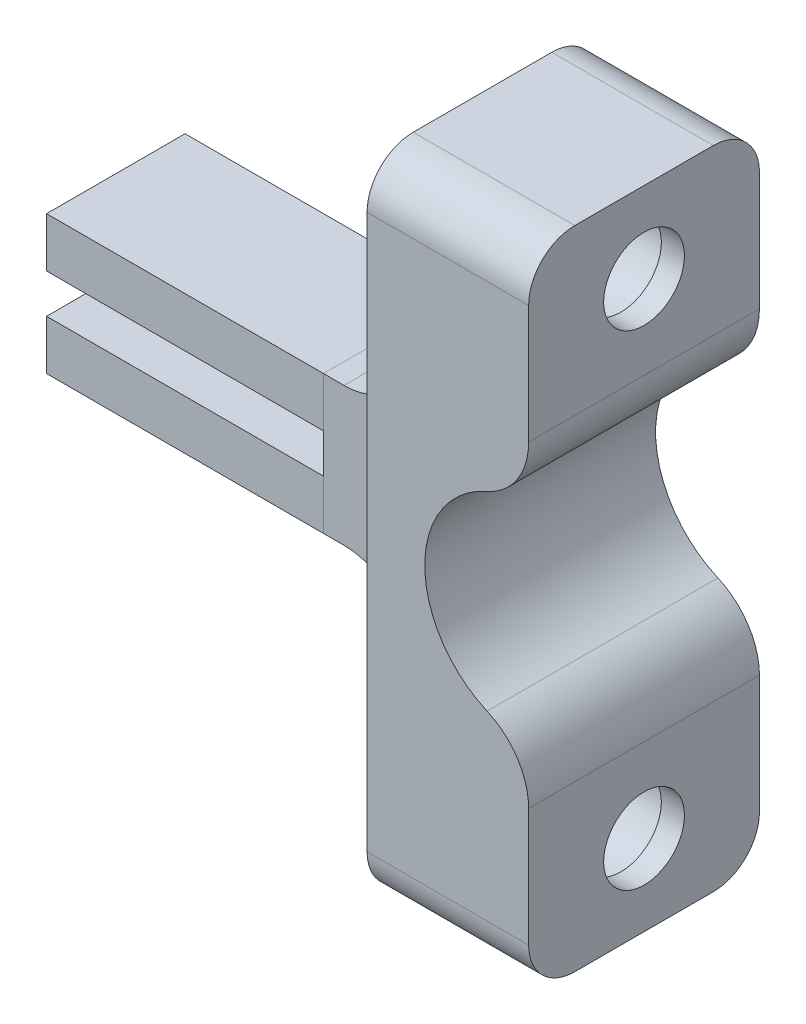
ISO-10303-21;
HEADER;
FILE_DESCRIPTION(('STEP AP214'),'2;1');
FILE_NAME('part.step','',(''),(''),'','','');
FILE_SCHEMA(('AUTOMOTIVE_DESIGN { 1 0 10303 214 1 1 1 1 }'));
ENDSEC;
DATA;
#1=APPLICATION_CONTEXT('core data for automotive mechanical design processes');
#2=APPLICATION_PROTOCOL_DEFINITION('international standard','automotive_design',2000,#1);
#3=PRODUCT_CONTEXT('',#1,'mechanical');
#4=PRODUCT('Part','Part','',(#3));
#5=PRODUCT_RELATED_PRODUCT_CATEGORY('part','',(#4));
#6=PRODUCT_DEFINITION_FORMATION('','',#4);
#7=PRODUCT_DEFINITION_CONTEXT('part definition',#1,'design');
#8=PRODUCT_DEFINITION('design','',#6,#7);
#9=PRODUCT_DEFINITION_SHAPE('','',#8);
#10=(LENGTH_UNIT() NAMED_UNIT(*) SI_UNIT(.MILLI.,.METRE.));
#11=(NAMED_UNIT(*) PLANE_ANGLE_UNIT() SI_UNIT($,.RADIAN.));
#12=(NAMED_UNIT(*) SI_UNIT($,.STERADIAN.) SOLID_ANGLE_UNIT());
#13=UNCERTAINTY_MEASURE_WITH_UNIT(LENGTH_MEASURE(1.E-05),#10,'distance_accuracy_value','');
#14=(GEOMETRIC_REPRESENTATION_CONTEXT(3) GLOBAL_UNCERTAINTY_ASSIGNED_CONTEXT((#13)) GLOBAL_UNIT_ASSIGNED_CONTEXT((#10,
#11,#12)) REPRESENTATION_CONTEXT('',''));
#15=CARTESIAN_POINT('',(0.,0.,0.));
#16=DIRECTION('',(0.,0.,1.));
#17=DIRECTION('',(1.,0.,0.));
#18=AXIS2_PLACEMENT_3D('',#15,#16,#17);
#19=CARTESIAN_POINT('',(0.888345193090202,-10.5,0.));
#20=DIRECTION('',(1.,0.,0.));
#21=DIRECTION('',(0.,0.,-1.));
#22=AXIS2_PLACEMENT_3D('',#19,#20,#21);
#23=CYLINDRICAL_SURFACE('',#22,2.25);
#24=CARTESIAN_POINT('',(9.8883451930902,-10.5,0.));
#25=DIRECTION('',(1.,0.,0.));
#26=DIRECTION('',(0.,0.,-1.));
#27=AXIS2_PLACEMENT_3D('',#24,#25,#26);
#28=CIRCLE('',#27,2.25);
#29=CARTESIAN_POINT('',(9.8883451930902,-10.5,-2.25));
#30=VERTEX_POINT('',#29);
#31=EDGE_CURVE('E284',#30,#30,#28,.T.);
#32=ORIENTED_EDGE('',*,*,#31,.F.);
#33=EDGE_LOOP('',(#32));
#34=FACE_BOUND('',#33,.T.);
#35=CARTESIAN_POINT('',(15.8883451930902,-10.5,0.));
#36=DIRECTION('',(1.,0.,0.));
#37=DIRECTION('',(0.,0.,-1.));
#38=AXIS2_PLACEMENT_3D('',#35,#36,#37);
#39=CIRCLE('',#38,2.25);
#40=CARTESIAN_POINT('',(15.8883451930902,-10.5,-2.25));
#41=VERTEX_POINT('',#40);
#42=EDGE_CURVE('E12',#41,#41,#39,.F.);
#43=ORIENTED_EDGE('',*,*,#42,.F.);
#44=EDGE_LOOP('',(#43));
#45=FACE_BOUND('',#44,.T.);
#46=ADVANCED_FACE('F46',(#34,#45),#23,.F.);
#47=CARTESIAN_POINT('',(0.888345193090202,10.5,0.));
#48=DIRECTION('',(1.,0.,0.));
#49=DIRECTION('',(0.,0.,-1.));
#50=AXIS2_PLACEMENT_3D('',#47,#48,#49);
#51=CYLINDRICAL_SURFACE('',#50,2.25);
#52=CARTESIAN_POINT('',(9.8883451930902,10.5,0.));
#53=DIRECTION('',(1.,0.,0.));
#54=DIRECTION('',(0.,0.,-1.));
#55=AXIS2_PLACEMENT_3D('',#52,#53,#54);
#56=CIRCLE('',#55,2.25);
#57=CARTESIAN_POINT('',(9.8883451930902,10.5,-2.25));
#58=VERTEX_POINT('',#57);
#59=EDGE_CURVE('E287',#58,#58,#56,.T.);
#60=ORIENTED_EDGE('',*,*,#59,.F.);
#61=EDGE_LOOP('',(#60));
#62=FACE_BOUND('',#61,.T.);
#63=CARTESIAN_POINT('',(15.8883451930902,10.5,0.));
#64=DIRECTION('',(1.,0.,0.));
#65=DIRECTION('',(0.,0.,-1.));
#66=AXIS2_PLACEMENT_3D('',#63,#64,#65);
#67=CIRCLE('',#66,2.25);
#68=CARTESIAN_POINT('',(15.8883451930902,10.5,-2.25));
#69=VERTEX_POINT('',#68);
#70=EDGE_CURVE('E54',#69,#69,#67,.F.);
#71=ORIENTED_EDGE('',*,*,#70,.F.);
#72=EDGE_LOOP('',(#71));
#73=FACE_BOUND('',#72,.T.);
#74=ADVANCED_FACE('F293',(#62,#73),#51,.F.);
#75=CARTESIAN_POINT('',(16.8883451930902,14.,5.));
#76=DIRECTION('',(-1.,0.,0.));
#77=DIRECTION('',(0.,0.,1.));
#78=AXIS2_PLACEMENT_3D('',#75,#76,#77);
#79=PLANE('',#78);
#80=DIRECTION('',(0.,0.,-1.));
#81=VECTOR('',#80,1.);
#82=CARTESIAN_POINT('',(16.8883451930902,-14.,5.));
#83=LINE('',#82,#81);
#84=CARTESIAN_POINT('',(16.8883451930902,-14.,3.));
#85=VERTEX_POINT('',#84);
#86=CARTESIAN_POINT('',(16.8883451930902,-14.,-3.));
#87=VERTEX_POINT('',#86);
#88=EDGE_CURVE('E411',#85,#87,#83,.T.);
#89=ORIENTED_EDGE('',*,*,#88,.T.);
#90=CARTESIAN_POINT('',(16.8883451930902,-12.,-3.));
#91=DIRECTION('',(-1.,0.,0.));
#92=DIRECTION('',(0.,0.,1.));
#93=AXIS2_PLACEMENT_3D('',#90,#91,#92);
#94=CIRCLE('',#93,2.);
#95=CARTESIAN_POINT('',(16.8883451930902,-12.,-5.));
#96=VERTEX_POINT('',#95);
#97=EDGE_CURVE('E69',#87,#96,#94,.F.);
#98=ORIENTED_EDGE('',*,*,#97,.T.);
#99=DIRECTION('',(0.,1.,0.));
#100=VECTOR('',#99,1.);
#101=CARTESIAN_POINT('',(16.8883451930902,14.,-5.));
#102=LINE('',#101,#100);
#103=CARTESIAN_POINT('',(16.8883451930902,-6.87386354243376,-5.));
#104=VERTEX_POINT('',#103);
#105=EDGE_CURVE('E393',#96,#104,#102,.T.);
#106=ORIENTED_EDGE('',*,*,#105,.T.);
#107=DIRECTION('',(0.,0.,1.));
#108=VECTOR('',#107,1.);
#109=CARTESIAN_POINT('',(16.8883451930902,-6.87386354243376,5.));
#110=LINE('',#109,#108);
#111=CARTESIAN_POINT('',(16.8883451930902,-6.87386354243376,5.));
#112=VERTEX_POINT('',#111);
#113=EDGE_CURVE('E213',#104,#112,#110,.T.);
#114=ORIENTED_EDGE('',*,*,#113,.T.);
#115=DIRECTION('',(0.,1.,0.));
#116=VECTOR('',#115,1.);
#117=CARTESIAN_POINT('',(16.8883451930902,14.,5.));
#118=LINE('',#117,#116);
#119=CARTESIAN_POINT('',(16.8883451930902,-12.,5.));
#120=VERTEX_POINT('',#119);
#121=EDGE_CURVE('E395',#120,#112,#118,.T.);
#122=ORIENTED_EDGE('',*,*,#121,.F.);
#123=CARTESIAN_POINT('',(16.8883451930902,-12.,3.));
#124=DIRECTION('',(-1.,0.,0.));
#125=DIRECTION('',(0.,0.,1.));
#126=AXIS2_PLACEMENT_3D('',#123,#124,#125);
#127=CIRCLE('',#126,2.);
#128=EDGE_CURVE('E61',#120,#85,#127,.F.);
#129=ORIENTED_EDGE('',*,*,#128,.T.);
#130=EDGE_LOOP('',(#89,#98,#106,#114,#122,#129));
#131=FACE_BOUND('',#130,.T.);
#132=CARTESIAN_POINT('',(16.8883451930902,-10.5,0.));
#133=DIRECTION('',(1.,0.,0.));
#134=DIRECTION('',(0.,0.,-1.));
#135=AXIS2_PLACEMENT_3D('',#132,#133,#134);
#136=CIRCLE('',#135,1.75);
#137=CARTESIAN_POINT('',(16.8883451930902,-10.5,-1.75));
#138=VERTEX_POINT('',#137);
#139=EDGE_CURVE('E452',#138,#138,#136,.T.);
#140=ORIENTED_EDGE('',*,*,#139,.F.);
#141=EDGE_LOOP('',(#140));
#142=FACE_BOUND('',#141,.T.);
#143=ADVANCED_FACE('F295',(#131,#142),#79,.F.);
#144=CARTESIAN_POINT('',(9.8883451930902,14.,5.));
#145=DIRECTION('',(1.,0.,0.));
#146=DIRECTION('',(0.,0.,-1.));
#147=AXIS2_PLACEMENT_3D('',#144,#145,#146);
#148=PLANE('',#147);
#149=ORIENTED_EDGE('',*,*,#59,.T.);
#150=EDGE_LOOP('',(#149));
#151=FACE_BOUND('',#150,.T.);
#152=ORIENTED_EDGE('',*,*,#31,.T.);
#153=EDGE_LOOP('',(#152));
#154=FACE_BOUND('',#153,.T.);
#155=DIRECTION('',(0.,0.,-1.));
#156=VECTOR('',#155,1.);
#157=CARTESIAN_POINT('',(9.8883451930902,14.,5.));
#158=LINE('',#157,#156);
#159=CARTESIAN_POINT('',(9.8883451930902,14.,3.));
#160=VERTEX_POINT('',#159);
#161=CARTESIAN_POINT('',(9.8883451930902,14.,-3.));
#162=VERTEX_POINT('',#161);
#163=EDGE_CURVE('E403',#160,#162,#158,.T.);
#164=ORIENTED_EDGE('',*,*,#163,.T.);
#165=CARTESIAN_POINT('',(9.8883451930902,12.,-3.));
#166=DIRECTION('',(1.,0.,0.));
#167=DIRECTION('',(0.,0.,-1.));
#168=AXIS2_PLACEMENT_3D('',#165,#166,#167);
#169=CIRCLE('',#168,2.);
#170=CARTESIAN_POINT('',(9.8883451930902,12.,-5.));
#171=VERTEX_POINT('',#170);
#172=EDGE_CURVE('E263',#162,#171,#169,.F.);
#173=ORIENTED_EDGE('',*,*,#172,.T.);
#174=DIRECTION('',(0.,-1.,0.));
#175=VECTOR('',#174,1.);
#176=CARTESIAN_POINT('',(9.8883451930902,14.,-5.));
#177=LINE('',#176,#175);
#178=CARTESIAN_POINT('',(9.8883451930902,-12.,-5.));
#179=VERTEX_POINT('',#178);
#180=EDGE_CURVE('E404',#171,#179,#177,.T.);
#181=ORIENTED_EDGE('',*,*,#180,.T.);
#182=CARTESIAN_POINT('',(9.8883451930902,-12.,-3.));
#183=DIRECTION('',(1.,0.,0.));
#184=DIRECTION('',(0.,0.,-1.));
#185=AXIS2_PLACEMENT_3D('',#182,#183,#184);
#186=CIRCLE('',#185,2.);
#187=CARTESIAN_POINT('',(9.8883451930902,-14.,-3.));
#188=VERTEX_POINT('',#187);
#189=EDGE_CURVE('E261',#179,#188,#186,.F.);
#190=ORIENTED_EDGE('',*,*,#189,.T.);
#191=DIRECTION('',(0.,0.,-1.));
#192=VECTOR('',#191,1.);
#193=CARTESIAN_POINT('',(9.8883451930902,-14.,5.));
#194=LINE('',#193,#192);
#195=CARTESIAN_POINT('',(9.8883451930902,-14.,3.));
#196=VERTEX_POINT('',#195);
#197=EDGE_CURVE('E388',#196,#188,#194,.T.);
#198=ORIENTED_EDGE('',*,*,#197,.F.);
#199=CARTESIAN_POINT('',(9.8883451930902,-12.,3.));
#200=DIRECTION('',(1.,0.,0.));
#201=DIRECTION('',(0.,0.,-1.));
#202=AXIS2_PLACEMENT_3D('',#199,#200,#201);
#203=CIRCLE('',#202,2.);
#204=CARTESIAN_POINT('',(9.8883451930902,-12.,5.));
#205=VERTEX_POINT('',#204);
#206=EDGE_CURVE('E259',#196,#205,#203,.F.);
#207=ORIENTED_EDGE('',*,*,#206,.T.);
#208=DIRECTION('',(0.,-1.,0.));
#209=VECTOR('',#208,1.);
#210=CARTESIAN_POINT('',(9.8883451930902,14.,5.));
#211=LINE('',#210,#209);
#212=CARTESIAN_POINT('',(9.8883451930902,12.,5.));
#213=VERTEX_POINT('',#212);
#214=EDGE_CURVE('E386',#213,#205,#211,.T.);
#215=ORIENTED_EDGE('',*,*,#214,.F.);
#216=CARTESIAN_POINT('',(9.8883451930902,12.,3.));
#217=DIRECTION('',(1.,0.,0.));
#218=DIRECTION('',(0.,0.,-1.));
#219=AXIS2_PLACEMENT_3D('',#216,#217,#218);
#220=CIRCLE('',#219,2.);
#221=EDGE_CURVE('E257',#213,#160,#220,.F.);
#222=ORIENTED_EDGE('',*,*,#221,.T.);
#223=EDGE_LOOP('',(#164,#173,#181,#190,#198,#207,#215,#222));
#224=FACE_BOUND('',#223,.T.);
#225=DIRECTION('',(0.,1.,0.));
#226=VECTOR('',#225,1.);
#227=CARTESIAN_POINT('',(9.8883451930902,0.,3.));
#228=LINE('',#227,#226);
#229=CARTESIAN_POINT('',(9.8883451930902,-6.,3.));
#230=VERTEX_POINT('',#229);
#231=CARTESIAN_POINT('',(9.8883451930902,6.,3.));
#232=VERTEX_POINT('',#231);
#233=EDGE_CURVE('E210',#230,#232,#228,.T.);
#234=ORIENTED_EDGE('',*,*,#233,.F.);
#235=DIRECTION('',(0.,0.,1.));
#236=VECTOR('',#235,1.);
#237=CARTESIAN_POINT('',(9.8883451930902,-6.,5.));
#238=LINE('',#237,#236);
#239=CARTESIAN_POINT('',(9.8883451930902,-6.,-3.));
#240=VERTEX_POINT('',#239);
#241=EDGE_CURVE('E237',#230,#240,#238,.F.);
#242=ORIENTED_EDGE('',*,*,#241,.T.);
#243=DIRECTION('',(0.,1.,0.));
#244=VECTOR('',#243,1.);
#245=CARTESIAN_POINT('',(9.8883451930902,0.,-3.));
#246=LINE('',#245,#244);
#247=CARTESIAN_POINT('',(9.8883451930902,6.,-3.));
#248=VERTEX_POINT('',#247);
#249=EDGE_CURVE('E203',#240,#248,#246,.T.);
#250=ORIENTED_EDGE('',*,*,#249,.T.);
#251=DIRECTION('',(0.,0.,-1.));
#252=VECTOR('',#251,1.);
#253=CARTESIAN_POINT('',(9.8883451930902,6.,5.));
#254=LINE('',#253,#252);
#255=EDGE_CURVE('E234',#248,#232,#254,.F.);
#256=ORIENTED_EDGE('',*,*,#255,.T.);
#257=EDGE_LOOP('',(#234,#242,#250,#256));
#258=FACE_BOUND('',#257,.T.);
#259=ADVANCED_FACE('F302',(#151,#154,#224,#258),#148,.F.);
#260=CARTESIAN_POINT('',(9.8883451930902,-14.,5.));
#261=DIRECTION('',(0.,1.,0.));
#262=DIRECTION('',(0.,0.,1.));
#263=AXIS2_PLACEMENT_3D('',#260,#261,#262);
#264=PLANE('',#263);
#265=ORIENTED_EDGE('',*,*,#197,.T.);
#266=DIRECTION('',(1.,0.,0.));
#267=VECTOR('',#266,1.);
#268=CARTESIAN_POINT('',(9.8883451930902,-14.,-3.));
#269=LINE('',#268,#267);
#270=EDGE_CURVE('E275',#188,#87,#269,.T.);
#271=ORIENTED_EDGE('',*,*,#270,.T.);
#272=ORIENTED_EDGE('',*,*,#88,.F.);
#273=DIRECTION('',(1.,0.,0.));
#274=VECTOR('',#273,1.);
#275=CARTESIAN_POINT('',(9.8883451930902,-14.,3.));
#276=LINE('',#275,#274);
#277=EDGE_CURVE('E273',#85,#196,#276,.F.);
#278=ORIENTED_EDGE('',*,*,#277,.T.);
#279=EDGE_LOOP('',(#265,#271,#272,#278));
#280=FACE_BOUND('',#279,.T.);
#281=ADVANCED_FACE('F331',(#280),#264,.F.);
#282=CARTESIAN_POINT('',(16.8883451930902,6.87386354243376,-5.));
#283=VERTEX_POINT('',#282);
#284=CARTESIAN_POINT('',(16.8883451930902,12.,-5.));
#285=VERTEX_POINT('',#284);
#286=EDGE_CURVE('E397',#283,#285,#102,.T.);
#287=ORIENTED_EDGE('',*,*,#286,.T.);
#288=CARTESIAN_POINT('',(16.8883451930902,12.,-3.));
#289=DIRECTION('',(-1.,0.,0.));
#290=DIRECTION('',(0.,0.,1.));
#291=AXIS2_PLACEMENT_3D('',#288,#289,#290);
#292=CIRCLE('',#291,2.);
#293=CARTESIAN_POINT('',(16.8883451930902,14.,-3.));
#294=VERTEX_POINT('',#293);
#295=EDGE_CURVE('E271',#285,#294,#292,.F.);
#296=ORIENTED_EDGE('',*,*,#295,.T.);
#297=DIRECTION('',(0.,0.,-1.));
#298=VECTOR('',#297,1.);
#299=CARTESIAN_POINT('',(16.8883451930902,14.,5.));
#300=LINE('',#299,#298);
#301=CARTESIAN_POINT('',(16.8883451930902,14.,3.));
#302=VERTEX_POINT('',#301);
#303=EDGE_CURVE('E408',#302,#294,#300,.T.);
#304=ORIENTED_EDGE('',*,*,#303,.F.);
#305=CARTESIAN_POINT('',(16.8883451930902,12.,3.));
#306=DIRECTION('',(-1.,0.,0.));
#307=DIRECTION('',(0.,0.,1.));
#308=AXIS2_PLACEMENT_3D('',#305,#306,#307);
#309=CIRCLE('',#308,2.);
#310=CARTESIAN_POINT('',(16.8883451930902,12.,5.));
#311=VERTEX_POINT('',#310);
#312=EDGE_CURVE('E269',#302,#311,#309,.F.);
#313=ORIENTED_EDGE('',*,*,#312,.T.);
#314=CARTESIAN_POINT('',(16.8883451930902,6.87386354243376,5.));
#315=VERTEX_POINT('',#314);
#316=EDGE_CURVE('E392',#315,#311,#118,.T.);
#317=ORIENTED_EDGE('',*,*,#316,.F.);
#318=DIRECTION('',(0.,0.,1.));
#319=VECTOR('',#318,1.);
#320=CARTESIAN_POINT('',(16.8883451930902,6.87386354243376,5.));
#321=LINE('',#320,#319);
#322=EDGE_CURVE('E229',#315,#283,#321,.F.);
#323=ORIENTED_EDGE('',*,*,#322,.T.);
#324=EDGE_LOOP('',(#287,#296,#304,#313,#317,#323));
#325=FACE_BOUND('',#324,.T.);
#326=CARTESIAN_POINT('',(16.8883451930902,10.5,0.));
#327=DIRECTION('',(1.,0.,0.));
#328=DIRECTION('',(0.,0.,-1.));
#329=AXIS2_PLACEMENT_3D('',#326,#327,#328);
#330=CIRCLE('',#329,1.75);
#331=CARTESIAN_POINT('',(16.8883451930902,10.5,-1.75));
#332=VERTEX_POINT('',#331);
#333=EDGE_CURVE('E446',#332,#332,#330,.T.);
#334=ORIENTED_EDGE('',*,*,#333,.F.);
#335=EDGE_LOOP('',(#334));
#336=FACE_BOUND('',#335,.T.);
#337=ADVANCED_FACE('F305',(#325,#336),#79,.F.);
#338=CARTESIAN_POINT('',(9.8883451930902,14.,5.));
#339=DIRECTION('',(0.,-1.,0.));
#340=DIRECTION('',(0.,0.,-1.));
#341=AXIS2_PLACEMENT_3D('',#338,#339,#340);
#342=PLANE('',#341);
#343=ORIENTED_EDGE('',*,*,#303,.T.);
#344=DIRECTION('',(-1.,0.,0.));
#345=VECTOR('',#344,1.);
#346=CARTESIAN_POINT('',(9.8883451930902,14.,-3.));
#347=LINE('',#346,#345);
#348=EDGE_CURVE('E254',#294,#162,#347,.T.);
#349=ORIENTED_EDGE('',*,*,#348,.T.);
#350=ORIENTED_EDGE('',*,*,#163,.F.);
#351=DIRECTION('',(-1.,0.,0.));
#352=VECTOR('',#351,1.);
#353=CARTESIAN_POINT('',(16.8883451930902,14.,3.));
#354=LINE('',#353,#352);
#355=EDGE_CURVE('E252',#160,#302,#354,.F.);
#356=ORIENTED_EDGE('',*,*,#355,.T.);
#357=EDGE_LOOP('',(#343,#349,#350,#356));
#358=FACE_BOUND('',#357,.T.);
#359=ADVANCED_FACE('F321',(#358),#342,.F.);
#360=CARTESIAN_POINT('',(0.,0.,5.));
#361=DIRECTION('',(0.,0.,1.));
#362=DIRECTION('',(1.,0.,0.));
#363=AXIS2_PLACEMENT_3D('',#360,#361,#362);
#364=PLANE('',#363);
#365=ORIENTED_EDGE('',*,*,#214,.T.);
#366=DIRECTION('',(1.,0.,0.));
#367=VECTOR('',#366,1.);
#368=CARTESIAN_POINT('',(16.8883451930902,-12.,5.));
#369=LINE('',#368,#367);
#370=EDGE_CURVE('E282',#205,#120,#369,.T.);
#371=ORIENTED_EDGE('',*,*,#370,.T.);
#372=ORIENTED_EDGE('',*,*,#121,.T.);
#373=CARTESIAN_POINT('',(13.8883451930902,-6.87386354243376,5.));
#374=DIRECTION('',(0.,0.,1.));
#375=DIRECTION('',(1.,0.,0.));
#376=AXIS2_PLACEMENT_3D('',#373,#374,#375);
#377=CIRCLE('',#376,3.);
#378=CARTESIAN_POINT('',(15.0883451930902,-4.12431812546026,5.));
#379=VERTEX_POINT('',#378);
#380=EDGE_CURVE('E218',#112,#379,#377,.T.);
#381=ORIENTED_EDGE('',*,*,#380,.T.);
#382=CARTESIAN_POINT('',(16.8883451930902,0.,5.));
#383=DIRECTION('',(0.,0.,1.));
#384=DIRECTION('',(1.,0.,0.));
#385=AXIS2_PLACEMENT_3D('',#382,#383,#384);
#386=CIRCLE('',#385,4.5);
#387=CARTESIAN_POINT('',(15.0883451930902,4.12431812546026,5.));
#388=VERTEX_POINT('',#387);
#389=EDGE_CURVE('E400',#388,#379,#386,.T.);
#390=ORIENTED_EDGE('',*,*,#389,.F.);
#391=CARTESIAN_POINT('',(13.8883451930902,6.87386354243376,5.));
#392=DIRECTION('',(0.,0.,1.));
#393=DIRECTION('',(1.,0.,0.));
#394=AXIS2_PLACEMENT_3D('',#391,#392,#393);
#395=CIRCLE('',#394,3.);
#396=EDGE_CURVE('E216',#388,#315,#395,.T.);
#397=ORIENTED_EDGE('',*,*,#396,.T.);
#398=ORIENTED_EDGE('',*,*,#316,.T.);
#399=DIRECTION('',(-1.,0.,0.));
#400=VECTOR('',#399,1.);
#401=CARTESIAN_POINT('',(9.8883451930902,12.,5.));
#402=LINE('',#401,#400);
#403=EDGE_CURVE('E279',#311,#213,#402,.T.);
#404=ORIENTED_EDGE('',*,*,#403,.T.);
#405=EDGE_LOOP('',(#365,#371,#372,#381,#390,#397,#398,#404));
#406=FACE_BOUND('',#405,.T.);
#407=ADVANCED_FACE('F317',(#406),#364,.T.);
#408=CARTESIAN_POINT('',(0.,0.,-5.));
#409=DIRECTION('',(0.,0.,1.));
#410=DIRECTION('',(1.,0.,0.));
#411=AXIS2_PLACEMENT_3D('',#408,#409,#410);
#412=PLANE('',#411);
#413=ORIENTED_EDGE('',*,*,#180,.F.);
#414=DIRECTION('',(-1.,0.,0.));
#415=VECTOR('',#414,1.);
#416=CARTESIAN_POINT('',(0.,12.,-5.));
#417=LINE('',#416,#415);
#418=EDGE_CURVE('E267',#171,#285,#417,.F.);
#419=ORIENTED_EDGE('',*,*,#418,.T.);
#420=ORIENTED_EDGE('',*,*,#286,.F.);
#421=CARTESIAN_POINT('',(13.8883451930902,6.87386354243376,-5.));
#422=DIRECTION('',(0.,0.,1.));
#423=DIRECTION('',(1.,0.,0.));
#424=AXIS2_PLACEMENT_3D('',#421,#422,#423);
#425=CIRCLE('',#424,3.);
#426=CARTESIAN_POINT('',(15.0883451930902,4.12431812546026,-5.));
#427=VERTEX_POINT('',#426);
#428=EDGE_CURVE('E224',#283,#427,#425,.F.);
#429=ORIENTED_EDGE('',*,*,#428,.T.);
#430=CARTESIAN_POINT('',(16.8883451930902,0.,-5.));
#431=DIRECTION('',(0.,0.,1.));
#432=DIRECTION('',(1.,0.,0.));
#433=AXIS2_PLACEMENT_3D('',#430,#431,#432);
#434=CIRCLE('',#433,4.5);
#435=CARTESIAN_POINT('',(15.0883451930902,-4.12431812546026,-5.));
#436=VERTEX_POINT('',#435);
#437=EDGE_CURVE('E286',#427,#436,#434,.T.);
#438=ORIENTED_EDGE('',*,*,#437,.T.);
#439=CARTESIAN_POINT('',(13.8883451930902,-6.87386354243376,-5.));
#440=DIRECTION('',(0.,0.,1.));
#441=DIRECTION('',(1.,0.,0.));
#442=AXIS2_PLACEMENT_3D('',#439,#440,#441);
#443=CIRCLE('',#442,3.);
#444=EDGE_CURVE('E226',#436,#104,#443,.F.);
#445=ORIENTED_EDGE('',*,*,#444,.T.);
#446=ORIENTED_EDGE('',*,*,#105,.F.);
#447=DIRECTION('',(1.,0.,0.));
#448=VECTOR('',#447,1.);
#449=CARTESIAN_POINT('',(0.,-12.,-5.));
#450=LINE('',#449,#448);
#451=EDGE_CURVE('E265',#96,#179,#450,.F.);
#452=ORIENTED_EDGE('',*,*,#451,.T.);
#453=EDGE_LOOP('',(#413,#419,#420,#429,#438,#445,#446,#452));
#454=FACE_BOUND('',#453,.T.);
#455=ADVANCED_FACE('F320',(#454),#412,.F.);
#456=CARTESIAN_POINT('',(6.,3.,-3.));
#457=DIRECTION('',(0.,1.,0.));
#458=DIRECTION('',(0.,0.,1.));
#459=AXIS2_PLACEMENT_3D('',#456,#457,#458);
#460=PLANE('',#459);
#461=DIRECTION('',(-1.,0.,0.));
#462=VECTOR('',#461,1.);
#463=CARTESIAN_POINT('',(6.,3.,3.));
#464=LINE('',#463,#462);
#465=CARTESIAN_POINT('',(6.8883451930902,3.,3.));
#466=VERTEX_POINT('',#465);
#467=CARTESIAN_POINT('',(6.,3.,3.));
#468=VERTEX_POINT('',#467);
#469=EDGE_CURVE('E199',#466,#468,#464,.T.);
#470=ORIENTED_EDGE('',*,*,#469,.F.);
#471=DIRECTION('',(0.,0.,-1.));
#472=VECTOR('',#471,1.);
#473=CARTESIAN_POINT('',(6.8883451930902,3.,-3.));
#474=LINE('',#473,#472);
#475=CARTESIAN_POINT('',(6.8883451930902,3.,-3.));
#476=VERTEX_POINT('',#475);
#477=EDGE_CURVE('E240',#466,#476,#474,.T.);
#478=ORIENTED_EDGE('',*,*,#477,.T.);
#479=DIRECTION('',(-1.,0.,0.));
#480=VECTOR('',#479,1.);
#481=CARTESIAN_POINT('',(6.,3.,-3.));
#482=LINE('',#481,#480);
#483=CARTESIAN_POINT('',(6.,3.,-3.));
#484=VERTEX_POINT('',#483);
#485=EDGE_CURVE('E186',#476,#484,#482,.T.);
#486=ORIENTED_EDGE('',*,*,#485,.T.);
#487=DIRECTION('',(0.,0.,1.));
#488=VECTOR('',#487,1.);
#489=CARTESIAN_POINT('',(6.,3.,-3.));
#490=LINE('',#489,#488);
#491=EDGE_CURVE('E185',#484,#468,#490,.T.);
#492=ORIENTED_EDGE('',*,*,#491,.T.);
#493=EDGE_LOOP('',(#470,#478,#486,#492));
#494=FACE_BOUND('',#493,.T.);
#495=ADVANCED_FACE('F325',(#494),#460,.T.);
#496=CARTESIAN_POINT('',(6.,-3.,-3.));
#497=DIRECTION('',(0.,-1.,0.));
#498=DIRECTION('',(0.,0.,-1.));
#499=AXIS2_PLACEMENT_3D('',#496,#497,#498);
#500=PLANE('',#499);
#501=DIRECTION('',(1.,0.,0.));
#502=VECTOR('',#501,1.);
#503=CARTESIAN_POINT('',(6.,-3.,-3.));
#504=LINE('',#503,#502);
#505=CARTESIAN_POINT('',(6.,-3.,-3.));
#506=VERTEX_POINT('',#505);
#507=CARTESIAN_POINT('',(6.8883451930902,-3.,-3.));
#508=VERTEX_POINT('',#507);
#509=EDGE_CURVE('E177',#506,#508,#504,.T.);
#510=ORIENTED_EDGE('',*,*,#509,.T.);
#511=DIRECTION('',(0.,0.,1.));
#512=VECTOR('',#511,1.);
#513=CARTESIAN_POINT('',(6.8883451930902,-3.,-3.));
#514=LINE('',#513,#512);
#515=CARTESIAN_POINT('',(6.8883451930902,-3.,3.));
#516=VERTEX_POINT('',#515);
#517=EDGE_CURVE('E232',#508,#516,#514,.T.);
#518=ORIENTED_EDGE('',*,*,#517,.T.);
#519=DIRECTION('',(1.,0.,0.));
#520=VECTOR('',#519,1.);
#521=CARTESIAN_POINT('',(6.,-3.,3.));
#522=LINE('',#521,#520);
#523=CARTESIAN_POINT('',(6.,-3.,3.));
#524=VERTEX_POINT('',#523);
#525=EDGE_CURVE('E180',#524,#516,#522,.T.);
#526=ORIENTED_EDGE('',*,*,#525,.F.);
#527=DIRECTION('',(0.,0.,1.));
#528=VECTOR('',#527,1.);
#529=CARTESIAN_POINT('',(6.,-3.,-3.));
#530=LINE('',#529,#528);
#531=EDGE_CURVE('E173',#506,#524,#530,.T.);
#532=ORIENTED_EDGE('',*,*,#531,.F.);
#533=EDGE_LOOP('',(#510,#518,#526,#532));
#534=FACE_BOUND('',#533,.T.);
#535=ADVANCED_FACE('F175',(#534),#500,.T.);
#536=CARTESIAN_POINT('',(0.,0.,-3.));
#537=DIRECTION('',(0.,0.,1.));
#538=DIRECTION('',(1.,0.,0.));
#539=AXIS2_PLACEMENT_3D('',#536,#537,#538);
#540=PLANE('',#539);
#541=ORIENTED_EDGE('',*,*,#249,.F.);
#542=CARTESIAN_POINT('',(6.8883451930902,-6.,-3.));
#543=DIRECTION('',(0.,0.,1.));
#544=DIRECTION('',(1.,0.,0.));
#545=AXIS2_PLACEMENT_3D('',#542,#543,#544);
#546=CIRCLE('',#545,3.);
#547=EDGE_CURVE('E194',#240,#508,#546,.T.);
#548=ORIENTED_EDGE('',*,*,#547,.T.);
#549=ORIENTED_EDGE('',*,*,#509,.F.);
#550=DIRECTION('',(0.,-1.,0.));
#551=VECTOR('',#550,1.);
#552=CARTESIAN_POINT('',(6.,3.,-3.));
#553=LINE('',#552,#551);
#554=EDGE_CURVE('E192',#484,#506,#553,.T.);
#555=ORIENTED_EDGE('',*,*,#554,.F.);
#556=ORIENTED_EDGE('',*,*,#485,.F.);
#557=CARTESIAN_POINT('',(6.8883451930902,6.,-3.));
#558=DIRECTION('',(0.,0.,1.));
#559=DIRECTION('',(1.,0.,0.));
#560=AXIS2_PLACEMENT_3D('',#557,#558,#559);
#561=CIRCLE('',#560,3.);
#562=EDGE_CURVE('E247',#476,#248,#561,.T.);
#563=ORIENTED_EDGE('',*,*,#562,.T.);
#564=EDGE_LOOP('',(#541,#548,#549,#555,#556,#563));
#565=FACE_BOUND('',#564,.T.);
#566=ADVANCED_FACE('F190',(#565),#540,.F.);
#567=CARTESIAN_POINT('',(0.,0.,3.));
#568=DIRECTION('',(0.,0.,1.));
#569=DIRECTION('',(1.,0.,0.));
#570=AXIS2_PLACEMENT_3D('',#567,#568,#569);
#571=PLANE('',#570);
#572=ORIENTED_EDGE('',*,*,#525,.T.);
#573=CARTESIAN_POINT('',(6.8883451930902,-6.,3.));
#574=DIRECTION('',(0.,0.,1.));
#575=DIRECTION('',(1.,0.,0.));
#576=AXIS2_PLACEMENT_3D('',#573,#574,#575);
#577=CIRCLE('',#576,3.);
#578=EDGE_CURVE('E243',#516,#230,#577,.F.);
#579=ORIENTED_EDGE('',*,*,#578,.T.);
#580=ORIENTED_EDGE('',*,*,#233,.T.);
#581=CARTESIAN_POINT('',(6.8883451930902,6.,3.));
#582=DIRECTION('',(0.,0.,1.));
#583=DIRECTION('',(1.,0.,0.));
#584=AXIS2_PLACEMENT_3D('',#581,#582,#583);
#585=CIRCLE('',#584,3.);
#586=EDGE_CURVE('E250',#232,#466,#585,.F.);
#587=ORIENTED_EDGE('',*,*,#586,.T.);
#588=ORIENTED_EDGE('',*,*,#469,.T.);
#589=DIRECTION('',(0.,-1.,0.));
#590=VECTOR('',#589,1.);
#591=CARTESIAN_POINT('',(6.,3.,3.));
#592=LINE('',#591,#590);
#593=EDGE_CURVE('E207',#468,#524,#592,.T.);
#594=ORIENTED_EDGE('',*,*,#593,.T.);
#595=EDGE_LOOP('',(#572,#579,#580,#587,#588,#594));
#596=FACE_BOUND('',#595,.T.);
#597=ADVANCED_FACE('F341',(#596),#571,.T.);
#598=CARTESIAN_POINT('',(6.,3.,-3.));
#599=DIRECTION('',(-1.,0.,0.));
#600=DIRECTION('',(0.,0.,1.));
#601=AXIS2_PLACEMENT_3D('',#598,#599,#600);
#602=PLANE('',#601);
#603=ORIENTED_EDGE('',*,*,#593,.F.);
#604=ORIENTED_EDGE('',*,*,#491,.F.);
#605=ORIENTED_EDGE('',*,*,#554,.T.);
#606=ORIENTED_EDGE('',*,*,#531,.T.);
#607=EDGE_LOOP('',(#603,#604,#605,#606));
#608=FACE_BOUND('',#607,.T.);
#609=ADVANCED_FACE('F197',(#608),#602,.T.);
#610=CARTESIAN_POINT('',(16.8883451930902,0.,-5.));
#611=DIRECTION('',(0.,0.,1.));
#612=DIRECTION('',(1.,0.,0.));
#613=AXIS2_PLACEMENT_3D('',#610,#611,#612);
#614=CYLINDRICAL_SURFACE('',#613,4.5);
#615=ORIENTED_EDGE('',*,*,#389,.T.);
#616=DIRECTION('',(0.,0.,1.));
#617=VECTOR('',#616,1.);
#618=CARTESIAN_POINT('',(15.0883451930902,-4.12431812546026,-5.));
#619=LINE('',#618,#617);
#620=EDGE_CURVE('E222',#379,#436,#619,.F.);
#621=ORIENTED_EDGE('',*,*,#620,.T.);
#622=ORIENTED_EDGE('',*,*,#437,.F.);
#623=DIRECTION('',(0.,0.,1.));
#624=VECTOR('',#623,1.);
#625=CARTESIAN_POINT('',(15.0883451930902,4.12431812546026,-5.));
#626=LINE('',#625,#624);
#627=EDGE_CURVE('E220',#427,#388,#626,.T.);
#628=ORIENTED_EDGE('',*,*,#627,.T.);
#629=EDGE_LOOP('',(#615,#621,#622,#628));
#630=FACE_BOUND('',#629,.T.);
#631=ADVANCED_FACE('F312',(#630),#614,.F.);
#632=CARTESIAN_POINT('',(13.8883451930902,-6.87386354243376,-5.));
#633=DIRECTION('',(0.,0.,1.));
#634=DIRECTION('',(1.,0.,0.));
#635=AXIS2_PLACEMENT_3D('',#632,#633,#634);
#636=CYLINDRICAL_SURFACE('',#635,3.);
#637=ORIENTED_EDGE('',*,*,#444,.F.);
#638=ORIENTED_EDGE('',*,*,#620,.F.);
#639=ORIENTED_EDGE('',*,*,#380,.F.);
#640=ORIENTED_EDGE('',*,*,#113,.F.);
#641=EDGE_LOOP('',(#637,#638,#639,#640));
#642=FACE_BOUND('',#641,.T.);
#643=ADVANCED_FACE('F315',(#642),#636,.T.);
#644=CARTESIAN_POINT('',(13.8883451930902,6.87386354243376,-5.));
#645=DIRECTION('',(0.,0.,1.));
#646=DIRECTION('',(1.,0.,0.));
#647=AXIS2_PLACEMENT_3D('',#644,#645,#646);
#648=CYLINDRICAL_SURFACE('',#647,3.);
#649=ORIENTED_EDGE('',*,*,#396,.F.);
#650=ORIENTED_EDGE('',*,*,#627,.F.);
#651=ORIENTED_EDGE('',*,*,#428,.F.);
#652=ORIENTED_EDGE('',*,*,#322,.F.);
#653=EDGE_LOOP('',(#649,#650,#651,#652));
#654=FACE_BOUND('',#653,.T.);
#655=ADVANCED_FACE('F354',(#654),#648,.T.);
#656=CARTESIAN_POINT('',(6.8883451930902,-6.,-3.));
#657=DIRECTION('',(0.,0.,1.));
#658=DIRECTION('',(1.,0.,0.));
#659=AXIS2_PLACEMENT_3D('',#656,#657,#658);
#660=CYLINDRICAL_SURFACE('',#659,3.);
#661=ORIENTED_EDGE('',*,*,#547,.F.);
#662=ORIENTED_EDGE('',*,*,#241,.F.);
#663=ORIENTED_EDGE('',*,*,#578,.F.);
#664=ORIENTED_EDGE('',*,*,#517,.F.);
#665=EDGE_LOOP('',(#661,#662,#663,#664));
#666=FACE_BOUND('',#665,.T.);
#667=ADVANCED_FACE('F358',(#666),#660,.F.);
#668=CARTESIAN_POINT('',(6.8883451930902,6.,-3.));
#669=DIRECTION('',(0.,0.,-1.));
#670=DIRECTION('',(-1.,0.,0.));
#671=AXIS2_PLACEMENT_3D('',#668,#669,#670);
#672=CYLINDRICAL_SURFACE('',#671,3.);
#673=ORIENTED_EDGE('',*,*,#586,.F.);
#674=ORIENTED_EDGE('',*,*,#255,.F.);
#675=ORIENTED_EDGE('',*,*,#562,.F.);
#676=ORIENTED_EDGE('',*,*,#477,.F.);
#677=EDGE_LOOP('',(#673,#674,#675,#676));
#678=FACE_BOUND('',#677,.T.);
#679=ADVANCED_FACE('F362',(#678),#672,.F.);
#680=CARTESIAN_POINT('',(9.8883451930902,12.,-3.));
#681=DIRECTION('',(-1.,0.,0.));
#682=DIRECTION('',(0.,0.,1.));
#683=AXIS2_PLACEMENT_3D('',#680,#681,#682);
#684=CYLINDRICAL_SURFACE('',#683,2.);
#685=ORIENTED_EDGE('',*,*,#295,.F.);
#686=ORIENTED_EDGE('',*,*,#418,.F.);
#687=ORIENTED_EDGE('',*,*,#172,.F.);
#688=ORIENTED_EDGE('',*,*,#348,.F.);
#689=EDGE_LOOP('',(#685,#686,#687,#688));
#690=FACE_BOUND('',#689,.T.);
#691=ADVANCED_FACE('F366',(#690),#684,.T.);
#692=CARTESIAN_POINT('',(9.8883451930902,-12.,-3.));
#693=DIRECTION('',(1.,0.,0.));
#694=DIRECTION('',(0.,0.,-1.));
#695=AXIS2_PLACEMENT_3D('',#692,#693,#694);
#696=CYLINDRICAL_SURFACE('',#695,2.);
#697=ORIENTED_EDGE('',*,*,#189,.F.);
#698=ORIENTED_EDGE('',*,*,#451,.F.);
#699=ORIENTED_EDGE('',*,*,#97,.F.);
#700=ORIENTED_EDGE('',*,*,#270,.F.);
#701=EDGE_LOOP('',(#697,#698,#699,#700));
#702=FACE_BOUND('',#701,.T.);
#703=ADVANCED_FACE('F370',(#702),#696,.T.);
#704=CARTESIAN_POINT('',(0.,-12.,3.));
#705=DIRECTION('',(-1.,0.,0.));
#706=DIRECTION('',(0.,0.,1.));
#707=AXIS2_PLACEMENT_3D('',#704,#705,#706);
#708=CYLINDRICAL_SURFACE('',#707,2.);
#709=ORIENTED_EDGE('',*,*,#206,.F.);
#710=ORIENTED_EDGE('',*,*,#277,.F.);
#711=ORIENTED_EDGE('',*,*,#128,.F.);
#712=ORIENTED_EDGE('',*,*,#370,.F.);
#713=EDGE_LOOP('',(#709,#710,#711,#712));
#714=FACE_BOUND('',#713,.T.);
#715=ADVANCED_FACE('F373',(#714),#708,.T.);
#716=CARTESIAN_POINT('',(0.,12.,3.));
#717=DIRECTION('',(1.,0.,0.));
#718=DIRECTION('',(0.,0.,-1.));
#719=AXIS2_PLACEMENT_3D('',#716,#717,#718);
#720=CYLINDRICAL_SURFACE('',#719,2.);
#721=ORIENTED_EDGE('',*,*,#312,.F.);
#722=ORIENTED_EDGE('',*,*,#355,.F.);
#723=ORIENTED_EDGE('',*,*,#221,.F.);
#724=ORIENTED_EDGE('',*,*,#403,.F.);
#725=EDGE_LOOP('',(#721,#722,#723,#724));
#726=FACE_BOUND('',#725,.T.);
#727=ADVANCED_FACE('F48',(#726),#720,.T.);
#728=CARTESIAN_POINT('',(15.8883451930902,10.5,0.));
#729=DIRECTION('',(1.,0.,0.));
#730=DIRECTION('',(0.,0.,-1.));
#731=AXIS2_PLACEMENT_3D('',#728,#729,#730);
#732=PLANE('',#731);
#733=CARTESIAN_POINT('',(15.8883451930902,10.5,0.));
#734=DIRECTION('',(1.,0.,0.));
#735=DIRECTION('',(0.,0.,-1.));
#736=AXIS2_PLACEMENT_3D('',#733,#734,#735);
#737=CIRCLE('',#736,1.75);
#738=CARTESIAN_POINT('',(15.8883451930902,10.5,-1.75));
#739=VERTEX_POINT('',#738);
#740=EDGE_CURVE('E445',#739,#739,#737,.T.);
#741=ORIENTED_EDGE('',*,*,#740,.T.);
#742=EDGE_LOOP('',(#741));
#743=FACE_BOUND('',#742,.T.);
#744=ORIENTED_EDGE('',*,*,#70,.T.);
#745=EDGE_LOOP('',(#744));
#746=FACE_BOUND('',#745,.T.);
#747=ADVANCED_FACE('F291',(#743,#746),#732,.F.);
#748=CARTESIAN_POINT('',(15.8883451930902,10.5,0.));
#749=DIRECTION('',(1.,0.,0.));
#750=DIRECTION('',(0.,0.,-1.));
#751=AXIS2_PLACEMENT_3D('',#748,#749,#750);
#752=CYLINDRICAL_SURFACE('',#751,1.75);
#753=ORIENTED_EDGE('',*,*,#740,.F.);
#754=EDGE_LOOP('',(#753));
#755=FACE_BOUND('',#754,.T.);
#756=ORIENTED_EDGE('',*,*,#333,.T.);
#757=EDGE_LOOP('',(#756));
#758=FACE_BOUND('',#757,.T.);
#759=ADVANCED_FACE('F470',(#755,#758),#752,.F.);
#760=CARTESIAN_POINT('',(15.8883451930902,-10.5,0.));
#761=DIRECTION('',(1.,0.,0.));
#762=DIRECTION('',(0.,0.,-1.));
#763=AXIS2_PLACEMENT_3D('',#760,#761,#762);
#764=PLANE('',#763);
#765=CARTESIAN_POINT('',(15.8883451930902,-10.5,0.));
#766=DIRECTION('',(1.,0.,0.));
#767=DIRECTION('',(0.,0.,-1.));
#768=AXIS2_PLACEMENT_3D('',#765,#766,#767);
#769=CIRCLE('',#768,1.75);
#770=CARTESIAN_POINT('',(15.8883451930902,-10.5,-1.75));
#771=VERTEX_POINT('',#770);
#772=EDGE_CURVE('E449',#771,#771,#769,.T.);
#773=ORIENTED_EDGE('',*,*,#772,.T.);
#774=EDGE_LOOP('',(#773));
#775=FACE_BOUND('',#774,.T.);
#776=ORIENTED_EDGE('',*,*,#42,.T.);
#777=EDGE_LOOP('',(#776));
#778=FACE_BOUND('',#777,.T.);
#779=ADVANCED_FACE('F458',(#775,#778),#764,.F.);
#780=CARTESIAN_POINT('',(15.8883451930902,-10.5,0.));
#781=DIRECTION('',(1.,0.,0.));
#782=DIRECTION('',(0.,0.,-1.));
#783=AXIS2_PLACEMENT_3D('',#780,#781,#782);
#784=CYLINDRICAL_SURFACE('',#783,1.75);
#785=ORIENTED_EDGE('',*,*,#772,.F.);
#786=EDGE_LOOP('',(#785));
#787=FACE_BOUND('',#786,.T.);
#788=ORIENTED_EDGE('',*,*,#139,.T.);
#789=EDGE_LOOP('',(#788));
#790=FACE_BOUND('',#789,.T.);
#791=ADVANCED_FACE('F461',(#787,#790),#784,.F.);
#792=CLOSED_SHELL('',(#46,#74,#143,#259,#281,#337,#359,#407,#455,#495,#535,#566,#597,#609,#631,
#643,#655,#667,#679,#691,#703,#715,#727,#747,#759,#779,#791));
#793=MANIFOLD_SOLID_BREP('B2',#792);
#794=CARTESIAN_POINT('',(0.,-0.85,3.));
#795=DIRECTION('',(0.,1.,0.));
#796=DIRECTION('',(0.,0.,1.));
#797=AXIS2_PLACEMENT_3D('',#794,#795,#796);
#798=PLANE('',#797);
#799=DIRECTION('',(1.,0.,0.));
#800=VECTOR('',#799,1.);
#801=CARTESIAN_POINT('',(0.,-0.85,-3.));
#802=LINE('',#801,#800);
#803=CARTESIAN_POINT('',(-6.,-0.85,-3.));
#804=VERTEX_POINT('',#803);
#805=CARTESIAN_POINT('',(6.,-0.85,-3.));
#806=VERTEX_POINT('',#805);
#807=EDGE_CURVE('E722',#804,#806,#802,.T.);
#808=ORIENTED_EDGE('',*,*,#807,.F.);
#809=DIRECTION('',(0.,0.,-1.));
#810=VECTOR('',#809,1.);
#811=CARTESIAN_POINT('',(-6.,-0.85,3.));
#812=LINE('',#811,#810);
#813=CARTESIAN_POINT('',(-6.,-0.85,3.));
#814=VERTEX_POINT('',#813);
#815=EDGE_CURVE('E44',#814,#804,#812,.T.);
#816=ORIENTED_EDGE('',*,*,#815,.F.);
#817=DIRECTION('',(1.,0.,0.));
#818=VECTOR('',#817,1.);
#819=CARTESIAN_POINT('',(0.,-0.85,3.));
#820=LINE('',#819,#818);
#821=CARTESIAN_POINT('',(6.,-0.85,3.));
#822=VERTEX_POINT('',#821);
#823=EDGE_CURVE('E716',#814,#822,#820,.T.);
#824=ORIENTED_EDGE('',*,*,#823,.T.);
#825=DIRECTION('',(0.,0.,-1.));
#826=VECTOR('',#825,1.);
#827=CARTESIAN_POINT('',(6.,-0.85,3.));
#828=LINE('',#827,#826);
#829=EDGE_CURVE('E697',#822,#806,#828,.T.);
#830=ORIENTED_EDGE('',*,*,#829,.T.);
#831=EDGE_LOOP('',(#808,#816,#824,#830));
#832=FACE_BOUND('',#831,.T.);
#833=ADVANCED_FACE('F659',(#832),#798,.T.);
#834=CARTESIAN_POINT('',(-6.,0.,3.));
#835=DIRECTION('',(-1.,0.,0.));
#836=DIRECTION('',(0.,0.,1.));
#837=AXIS2_PLACEMENT_3D('',#834,#835,#836);
#838=PLANE('',#837);
#839=DIRECTION('',(0.,1.,0.));
#840=VECTOR('',#839,1.);
#841=CARTESIAN_POINT('',(-6.,0.,-3.));
#842=LINE('',#841,#840);
#843=CARTESIAN_POINT('',(-6.,-3.,-3.));
#844=VERTEX_POINT('',#843);
#845=EDGE_CURVE('E710',#844,#804,#842,.T.);
#846=ORIENTED_EDGE('',*,*,#845,.F.);
#847=DIRECTION('',(0.,0.,-1.));
#848=VECTOR('',#847,1.);
#849=CARTESIAN_POINT('',(-6.,-3.,3.));
#850=LINE('',#849,#848);
#851=CARTESIAN_POINT('',(-6.,-3.,3.));
#852=VERTEX_POINT('',#851);
#853=EDGE_CURVE('E667',#852,#844,#850,.T.);
#854=ORIENTED_EDGE('',*,*,#853,.F.);
#855=DIRECTION('',(0.,1.,0.));
#856=VECTOR('',#855,1.);
#857=CARTESIAN_POINT('',(-6.,0.,3.));
#858=LINE('',#857,#856);
#859=EDGE_CURVE('E708',#852,#814,#858,.T.);
#860=ORIENTED_EDGE('',*,*,#859,.T.);
#861=ORIENTED_EDGE('',*,*,#815,.T.);
#862=EDGE_LOOP('',(#846,#854,#860,#861));
#863=FACE_BOUND('',#862,.T.);
#864=ADVANCED_FACE('F706',(#863),#838,.T.);
#865=CARTESIAN_POINT('',(0.,-3.,3.));
#866=DIRECTION('',(0.,1.,0.));
#867=DIRECTION('',(0.,0.,1.));
#868=AXIS2_PLACEMENT_3D('',#865,#866,#867);
#869=PLANE('',#868);
#870=DIRECTION('',(1.,0.,0.));
#871=VECTOR('',#870,1.);
#872=CARTESIAN_POINT('',(0.,-3.,-3.));
#873=LINE('',#872,#871);
#874=CARTESIAN_POINT('',(6.,-3.,-3.));
#875=VERTEX_POINT('',#874);
#876=EDGE_CURVE('E690',#844,#875,#873,.T.);
#877=ORIENTED_EDGE('',*,*,#876,.T.);
#878=DIRECTION('',(0.,0.,-1.));
#879=VECTOR('',#878,1.);
#880=CARTESIAN_POINT('',(6.,-3.,3.));
#881=LINE('',#880,#879);
#882=CARTESIAN_POINT('',(6.,-3.,3.));
#883=VERTEX_POINT('',#882);
#884=EDGE_CURVE('E711',#883,#875,#881,.T.);
#885=ORIENTED_EDGE('',*,*,#884,.F.);
#886=DIRECTION('',(1.,0.,0.));
#887=VECTOR('',#886,1.);
#888=CARTESIAN_POINT('',(0.,-3.,3.));
#889=LINE('',#888,#887);
#890=EDGE_CURVE('E712',#852,#883,#889,.T.);
#891=ORIENTED_EDGE('',*,*,#890,.F.);
#892=ORIENTED_EDGE('',*,*,#853,.T.);
#893=EDGE_LOOP('',(#877,#885,#891,#892));
#894=FACE_BOUND('',#893,.T.);
#895=ADVANCED_FACE('F713',(#894),#869,.F.);
#896=CARTESIAN_POINT('',(6.,0.,3.));
#897=DIRECTION('',(-1.,0.,0.));
#898=DIRECTION('',(0.,0.,1.));
#899=AXIS2_PLACEMENT_3D('',#896,#897,#898);
#900=PLANE('',#899);
#901=DIRECTION('',(0.,1.,0.));
#902=VECTOR('',#901,1.);
#903=CARTESIAN_POINT('',(6.,0.,-3.));
#904=LINE('',#903,#902);
#905=EDGE_CURVE('E718',#875,#806,#904,.T.);
#906=ORIENTED_EDGE('',*,*,#905,.T.);
#907=ORIENTED_EDGE('',*,*,#829,.F.);
#908=DIRECTION('',(0.,1.,0.));
#909=VECTOR('',#908,1.);
#910=CARTESIAN_POINT('',(6.,0.,3.));
#911=LINE('',#910,#909);
#912=EDGE_CURVE('E675',#883,#822,#911,.T.);
#913=ORIENTED_EDGE('',*,*,#912,.F.);
#914=ORIENTED_EDGE('',*,*,#884,.T.);
#915=EDGE_LOOP('',(#906,#907,#913,#914));
#916=FACE_BOUND('',#915,.T.);
#917=ADVANCED_FACE('F731',(#916),#900,.F.);
#918=CARTESIAN_POINT('',(0.,0.,3.));
#919=DIRECTION('',(0.,0.,1.));
#920=DIRECTION('',(1.,0.,0.));
#921=AXIS2_PLACEMENT_3D('',#918,#919,#920);
#922=PLANE('',#921);
#923=ORIENTED_EDGE('',*,*,#823,.F.);
#924=ORIENTED_EDGE('',*,*,#859,.F.);
#925=ORIENTED_EDGE('',*,*,#890,.T.);
#926=ORIENTED_EDGE('',*,*,#912,.T.);
#927=EDGE_LOOP('',(#923,#924,#925,#926));
#928=FACE_BOUND('',#927,.T.);
#929=ADVANCED_FACE('F715',(#928),#922,.T.);
#930=CARTESIAN_POINT('',(0.,0.,-3.));
#931=DIRECTION('',(0.,0.,1.));
#932=DIRECTION('',(1.,0.,0.));
#933=AXIS2_PLACEMENT_3D('',#930,#931,#932);
#934=PLANE('',#933);
#935=ORIENTED_EDGE('',*,*,#807,.T.);
#936=ORIENTED_EDGE('',*,*,#905,.F.);
#937=ORIENTED_EDGE('',*,*,#876,.F.);
#938=ORIENTED_EDGE('',*,*,#845,.T.);
#939=EDGE_LOOP('',(#935,#936,#937,#938));
#940=FACE_BOUND('',#939,.T.);
#941=ADVANCED_FACE('F733',(#940),#934,.F.);
#942=CLOSED_SHELL('',(#833,#864,#895,#917,#929,#941));
#943=MANIFOLD_SOLID_BREP('B6',#942);
#944=CARTESIAN_POINT('',(-6.,0.,3.));
#945=DIRECTION('',(-1.,0.,0.));
#946=DIRECTION('',(0.,0.,1.));
#947=AXIS2_PLACEMENT_3D('',#944,#945,#946);
#948=PLANE('',#947);
#949=DIRECTION('',(0.,1.,0.));
#950=VECTOR('',#949,1.);
#951=CARTESIAN_POINT('',(-6.,0.,-3.));
#952=LINE('',#951,#950);
#953=CARTESIAN_POINT('',(-6.,0.85,-3.));
#954=VERTEX_POINT('',#953);
#955=CARTESIAN_POINT('',(-6.,3.,-3.));
#956=VERTEX_POINT('',#955);
#957=EDGE_CURVE('E846',#954,#956,#952,.T.);
#958=ORIENTED_EDGE('',*,*,#957,.F.);
#959=DIRECTION('',(0.,0.,-1.));
#960=VECTOR('',#959,1.);
#961=CARTESIAN_POINT('',(-6.,0.85,3.));
#962=LINE('',#961,#960);
#963=CARTESIAN_POINT('',(-6.,0.85,3.));
#964=VERTEX_POINT('',#963);
#965=EDGE_CURVE('E657',#964,#954,#962,.T.);
#966=ORIENTED_EDGE('',*,*,#965,.F.);
#967=DIRECTION('',(0.,1.,0.));
#968=VECTOR('',#967,1.);
#969=CARTESIAN_POINT('',(-6.,0.,3.));
#970=LINE('',#969,#968);
#971=CARTESIAN_POINT('',(-6.,3.,3.));
#972=VERTEX_POINT('',#971);
#973=EDGE_CURVE('E831',#964,#972,#970,.T.);
#974=ORIENTED_EDGE('',*,*,#973,.T.);
#975=DIRECTION('',(0.,0.,-1.));
#976=VECTOR('',#975,1.);
#977=CARTESIAN_POINT('',(-6.,3.,3.));
#978=LINE('',#977,#976);
#979=EDGE_CURVE('E799',#972,#956,#978,.T.);
#980=ORIENTED_EDGE('',*,*,#979,.T.);
#981=EDGE_LOOP('',(#958,#966,#974,#980));
#982=FACE_BOUND('',#981,.T.);
#983=ADVANCED_FACE('F783',(#982),#948,.T.);
#984=CARTESIAN_POINT('',(0.,0.85,3.));
#985=DIRECTION('',(0.,1.,0.));
#986=DIRECTION('',(0.,0.,1.));
#987=AXIS2_PLACEMENT_3D('',#984,#985,#986);
#988=PLANE('',#987);
#989=DIRECTION('',(1.,0.,0.));
#990=VECTOR('',#989,1.);
#991=CARTESIAN_POINT('',(0.,0.85,-3.));
#992=LINE('',#991,#990);
#993=CARTESIAN_POINT('',(6.,0.85,-3.));
#994=VERTEX_POINT('',#993);
#995=EDGE_CURVE('E837',#954,#994,#992,.T.);
#996=ORIENTED_EDGE('',*,*,#995,.T.);
#997=DIRECTION('',(0.,0.,-1.));
#998=VECTOR('',#997,1.);
#999=CARTESIAN_POINT('',(6.,0.85,3.));
#1000=LINE('',#999,#998);
#1001=CARTESIAN_POINT('',(6.,0.85,3.));
#1002=VERTEX_POINT('',#1001);
#1003=EDGE_CURVE('E791',#1002,#994,#1000,.T.);
#1004=ORIENTED_EDGE('',*,*,#1003,.F.);
#1005=DIRECTION('',(1.,0.,0.));
#1006=VECTOR('',#1005,1.);
#1007=CARTESIAN_POINT('',(0.,0.85,3.));
#1008=LINE('',#1007,#1006);
#1009=EDGE_CURVE('E825',#964,#1002,#1008,.T.);
#1010=ORIENTED_EDGE('',*,*,#1009,.F.);
#1011=ORIENTED_EDGE('',*,*,#965,.T.);
#1012=EDGE_LOOP('',(#996,#1004,#1010,#1011));
#1013=FACE_BOUND('',#1012,.T.);
#1014=ADVANCED_FACE('F835',(#1013),#988,.F.);
#1015=CARTESIAN_POINT('',(6.,0.,3.));
#1016=DIRECTION('',(-1.,0.,0.));
#1017=DIRECTION('',(0.,0.,1.));
#1018=AXIS2_PLACEMENT_3D('',#1015,#1016,#1017);
#1019=PLANE('',#1018);
#1020=DIRECTION('',(0.,1.,0.));
#1021=VECTOR('',#1020,1.);
#1022=CARTESIAN_POINT('',(6.,0.,-3.));
#1023=LINE('',#1022,#1021);
#1024=CARTESIAN_POINT('',(6.,3.,-3.));
#1025=VERTEX_POINT('',#1024);
#1026=EDGE_CURVE('E849',#994,#1025,#1023,.T.);
#1027=ORIENTED_EDGE('',*,*,#1026,.T.);
#1028=DIRECTION('',(0.,0.,-1.));
#1029=VECTOR('',#1028,1.);
#1030=CARTESIAN_POINT('',(6.,3.,3.));
#1031=LINE('',#1030,#1029);
#1032=CARTESIAN_POINT('',(6.,3.,3.));
#1033=VERTEX_POINT('',#1032);
#1034=EDGE_CURVE('E813',#1033,#1025,#1031,.T.);
#1035=ORIENTED_EDGE('',*,*,#1034,.F.);
#1036=DIRECTION('',(0.,1.,0.));
#1037=VECTOR('',#1036,1.);
#1038=CARTESIAN_POINT('',(6.,0.,3.));
#1039=LINE('',#1038,#1037);
#1040=EDGE_CURVE('E830',#1002,#1033,#1039,.T.);
#1041=ORIENTED_EDGE('',*,*,#1040,.F.);
#1042=ORIENTED_EDGE('',*,*,#1003,.T.);
#1043=EDGE_LOOP('',(#1027,#1035,#1041,#1042));
#1044=FACE_BOUND('',#1043,.T.);
#1045=ADVANCED_FACE('F840',(#1044),#1019,.F.);
#1046=CARTESIAN_POINT('',(0.,3.,3.));
#1047=DIRECTION('',(0.,1.,0.));
#1048=DIRECTION('',(0.,0.,1.));
#1049=AXIS2_PLACEMENT_3D('',#1046,#1047,#1048);
#1050=PLANE('',#1049);
#1051=DIRECTION('',(1.,0.,0.));
#1052=VECTOR('',#1051,1.);
#1053=CARTESIAN_POINT('',(0.,3.,-3.));
#1054=LINE('',#1053,#1052);
#1055=EDGE_CURVE('E851',#956,#1025,#1054,.T.);
#1056=ORIENTED_EDGE('',*,*,#1055,.F.);
#1057=ORIENTED_EDGE('',*,*,#979,.F.);
#1058=DIRECTION('',(1.,0.,0.));
#1059=VECTOR('',#1058,1.);
#1060=CARTESIAN_POINT('',(0.,3.,3.));
#1061=LINE('',#1060,#1059);
#1062=EDGE_CURVE('E841',#972,#1033,#1061,.T.);
#1063=ORIENTED_EDGE('',*,*,#1062,.T.);
#1064=ORIENTED_EDGE('',*,*,#1034,.T.);
#1065=EDGE_LOOP('',(#1056,#1057,#1063,#1064));
#1066=FACE_BOUND('',#1065,.T.);
#1067=ADVANCED_FACE('F856',(#1066),#1050,.T.);
#1068=CARTESIAN_POINT('',(0.,0.,3.));
#1069=DIRECTION('',(0.,0.,1.));
#1070=DIRECTION('',(1.,0.,0.));
#1071=AXIS2_PLACEMENT_3D('',#1068,#1069,#1070);
#1072=PLANE('',#1071);
#1073=ORIENTED_EDGE('',*,*,#973,.F.);
#1074=ORIENTED_EDGE('',*,*,#1009,.T.);
#1075=ORIENTED_EDGE('',*,*,#1040,.T.);
#1076=ORIENTED_EDGE('',*,*,#1062,.F.);
#1077=EDGE_LOOP('',(#1073,#1074,#1075,#1076));
#1078=FACE_BOUND('',#1077,.T.);
#1079=ADVANCED_FACE('F827',(#1078),#1072,.T.);
#1080=CARTESIAN_POINT('',(0.,0.,-3.));
#1081=DIRECTION('',(0.,0.,1.));
#1082=DIRECTION('',(1.,0.,0.));
#1083=AXIS2_PLACEMENT_3D('',#1080,#1081,#1082);
#1084=PLANE('',#1083);
#1085=ORIENTED_EDGE('',*,*,#957,.T.);
#1086=ORIENTED_EDGE('',*,*,#1055,.T.);
#1087=ORIENTED_EDGE('',*,*,#1026,.F.);
#1088=ORIENTED_EDGE('',*,*,#995,.F.);
#1089=EDGE_LOOP('',(#1085,#1086,#1087,#1088));
#1090=FACE_BOUND('',#1089,.T.);
#1091=ADVANCED_FACE('F863',(#1090),#1084,.F.);
#1092=CLOSED_SHELL('',(#983,#1014,#1045,#1067,#1079,#1091));
#1093=MANIFOLD_SOLID_BREP('B38',#1092);
#1094=ADVANCED_BREP_SHAPE_REPRESENTATION('',(#18,#793,#943,#1093),#14);
#1095=SHAPE_DEFINITION_REPRESENTATION(#9,#1094);
ENDSEC;
END-ISO-10303-21;
